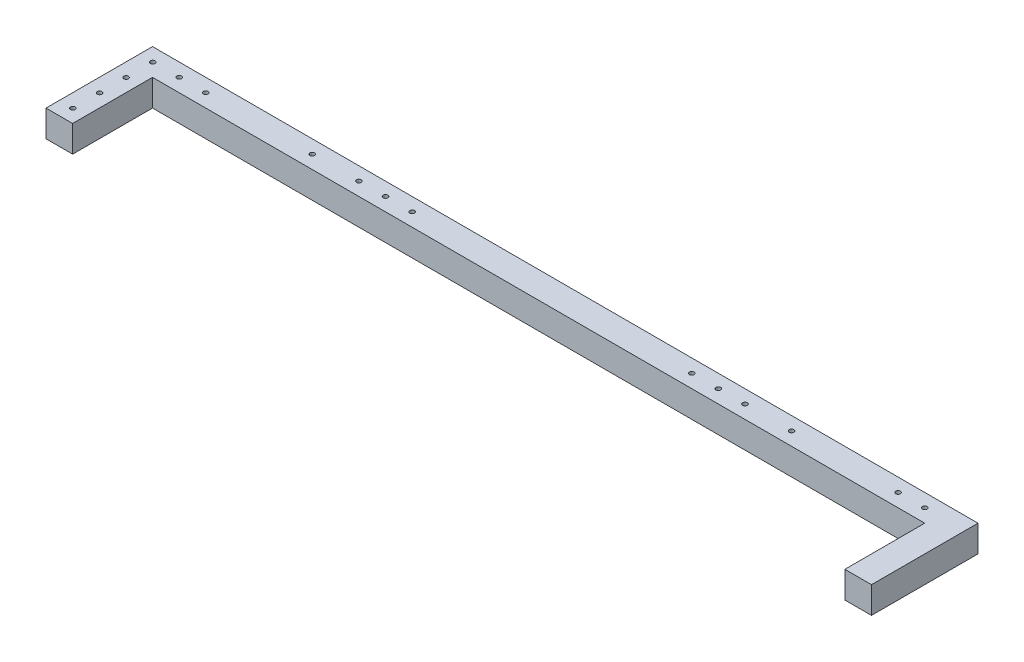
ISO-10303-21;
HEADER;
FILE_DESCRIPTION(('STEP AP214'),'2;1');
FILE_NAME('part.step','',(''),(''),'','','');
FILE_SCHEMA(('AUTOMOTIVE_DESIGN { 1 0 10303 214 1 1 1 1 }'));
ENDSEC;
DATA;
#1=APPLICATION_CONTEXT('core data for automotive mechanical design processes');
#2=APPLICATION_PROTOCOL_DEFINITION('international standard','automotive_design',2000,#1);
#3=PRODUCT_CONTEXT('',#1,'mechanical');
#4=PRODUCT('Part','Part','',(#3));
#5=PRODUCT_RELATED_PRODUCT_CATEGORY('part','',(#4));
#6=PRODUCT_DEFINITION_FORMATION('','',#4);
#7=PRODUCT_DEFINITION_CONTEXT('part definition',#1,'design');
#8=PRODUCT_DEFINITION('design','',#6,#7);
#9=PRODUCT_DEFINITION_SHAPE('','',#8);
#10=(LENGTH_UNIT() NAMED_UNIT(*) SI_UNIT(.MILLI.,.METRE.));
#11=(NAMED_UNIT(*) PLANE_ANGLE_UNIT() SI_UNIT($,.RADIAN.));
#12=(NAMED_UNIT(*) SI_UNIT($,.STERADIAN.) SOLID_ANGLE_UNIT());
#13=UNCERTAINTY_MEASURE_WITH_UNIT(LENGTH_MEASURE(1.E-05),#10,'distance_accuracy_value','');
#14=(GEOMETRIC_REPRESENTATION_CONTEXT(3) GLOBAL_UNCERTAINTY_ASSIGNED_CONTEXT((#13)) GLOBAL_UNIT_ASSIGNED_CONTEXT((#10,
#11,#12)) REPRESENTATION_CONTEXT('',''));
#15=CARTESIAN_POINT('',(0.,0.,0.));
#16=DIRECTION('',(0.,0.,1.));
#17=DIRECTION('',(1.,0.,0.));
#18=AXIS2_PLACEMENT_3D('',#15,#16,#17);
#19=CARTESIAN_POINT('',(0.,20.,0.));
#20=DIRECTION('',(0.,1.,0.));
#21=DIRECTION('',(0.,0.,1.));
#22=AXIS2_PLACEMENT_3D('',#19,#20,#21);
#23=PLANE('',#22);
#24=CARTESIAN_POINT('',(280.,20.,0.));
#25=DIRECTION('',(0.,1.,0.));
#26=DIRECTION('',(0.,0.,1.));
#27=AXIS2_PLACEMENT_3D('',#24,#25,#26);
#28=CIRCLE('',#27,1.74999999999998);
#29=CARTESIAN_POINT('',(280.,20.,1.74999999999999));
#30=VERTEX_POINT('',#29);
#31=EDGE_CURVE('E310',#30,#30,#28,.T.);
#32=ORIENTED_EDGE('',*,*,#31,.F.);
#33=EDGE_LOOP('',(#32));
#34=FACE_BOUND('',#33,.T.);
#35=CARTESIAN_POINT('',(260.,20.,0.));
#36=DIRECTION('',(0.,1.,0.));
#37=DIRECTION('',(0.,0.,1.));
#38=AXIS2_PLACEMENT_3D('',#35,#36,#37);
#39=CIRCLE('',#38,1.74999999999998);
#40=CARTESIAN_POINT('',(260.,20.,1.74999999999999));
#41=VERTEX_POINT('',#40);
#42=EDGE_CURVE('E309',#41,#41,#39,.T.);
#43=ORIENTED_EDGE('',*,*,#42,.F.);
#44=EDGE_LOOP('',(#43));
#45=FACE_BOUND('',#44,.T.);
#46=CARTESIAN_POINT('',(180.,20.,0.));
#47=DIRECTION('',(0.,1.,0.));
#48=DIRECTION('',(0.,0.,1.));
#49=AXIS2_PLACEMENT_3D('',#46,#47,#48);
#50=CIRCLE('',#49,1.75000000000001);
#51=CARTESIAN_POINT('',(180.,20.,1.75000000000002));
#52=VERTEX_POINT('',#51);
#53=EDGE_CURVE('E338',#52,#52,#50,.T.);
#54=ORIENTED_EDGE('',*,*,#53,.F.);
#55=EDGE_LOOP('',(#54));
#56=FACE_BOUND('',#55,.T.);
#57=CARTESIAN_POINT('',(145.,20.,0.));
#58=DIRECTION('',(0.,1.,0.));
#59=DIRECTION('',(0.,0.,1.));
#60=AXIS2_PLACEMENT_3D('',#57,#58,#59);
#61=CIRCLE('',#60,1.75000000000001);
#62=CARTESIAN_POINT('',(145.,20.,1.75000000000001));
#63=VERTEX_POINT('',#62);
#64=EDGE_CURVE('E371',#63,#63,#61,.T.);
#65=ORIENTED_EDGE('',*,*,#64,.F.);
#66=EDGE_LOOP('',(#65));
#67=FACE_BOUND('',#66,.T.);
#68=CARTESIAN_POINT('',(125.,20.,0.));
#69=DIRECTION('',(0.,1.,0.));
#70=DIRECTION('',(0.,0.,1.));
#71=AXIS2_PLACEMENT_3D('',#68,#69,#70);
#72=CIRCLE('',#71,1.75000000000001);
#73=CARTESIAN_POINT('',(125.,20.,1.75));
#74=VERTEX_POINT('',#73);
#75=EDGE_CURVE('E361',#74,#74,#72,.T.);
#76=ORIENTED_EDGE('',*,*,#75,.F.);
#77=EDGE_LOOP('',(#76));
#78=FACE_BOUND('',#77,.T.);
#79=CARTESIAN_POINT('',(105.,20.,0.));
#80=DIRECTION('',(0.,1.,0.));
#81=DIRECTION('',(0.,0.,1.));
#82=AXIS2_PLACEMENT_3D('',#79,#80,#81);
#83=CIRCLE('',#82,1.75);
#84=CARTESIAN_POINT('',(105.,20.,1.74999999999992));
#85=VERTEX_POINT('',#84);
#86=EDGE_CURVE('E354',#85,#85,#83,.T.);
#87=ORIENTED_EDGE('',*,*,#86,.F.);
#88=EDGE_LOOP('',(#87));
#89=FACE_BOUND('',#88,.T.);
#90=CARTESIAN_POINT('',(-145.,20.,0.));
#91=DIRECTION('',(0.,1.,0.));
#92=DIRECTION('',(0.,0.,1.));
#93=AXIS2_PLACEMENT_3D('',#90,#91,#92);
#94=CIRCLE('',#93,1.75000000000001);
#95=CARTESIAN_POINT('',(-145.,20.,1.74999999999995));
#96=VERTEX_POINT('',#95);
#97=EDGE_CURVE('E347',#96,#96,#94,.T.);
#98=ORIENTED_EDGE('',*,*,#97,.F.);
#99=EDGE_LOOP('',(#98));
#100=FACE_BOUND('',#99,.T.);
#101=CARTESIAN_POINT('',(-105.,20.,0.));
#102=DIRECTION('',(0.,1.,0.));
#103=DIRECTION('',(0.,0.,1.));
#104=AXIS2_PLACEMENT_3D('',#101,#102,#103);
#105=CIRCLE('',#104,1.75);
#106=CARTESIAN_POINT('',(-105.,20.,1.74999999999995));
#107=VERTEX_POINT('',#106);
#108=EDGE_CURVE('E343',#107,#107,#105,.T.);
#109=ORIENTED_EDGE('',*,*,#108,.F.);
#110=EDGE_LOOP('',(#109));
#111=FACE_BOUND('',#110,.T.);
#112=CARTESIAN_POINT('',(-125.,20.,0.));
#113=DIRECTION('',(0.,1.,0.));
#114=DIRECTION('',(0.,0.,1.));
#115=AXIS2_PLACEMENT_3D('',#112,#113,#114);
#116=CIRCLE('',#115,1.75000000000001);
#117=CARTESIAN_POINT('',(-125.,20.,1.74999999999996));
#118=VERTEX_POINT('',#117);
#119=EDGE_CURVE('E348',#118,#118,#116,.T.);
#120=ORIENTED_EDGE('',*,*,#119,.F.);
#121=EDGE_LOOP('',(#120));
#122=FACE_BOUND('',#121,.T.);
#123=CARTESIAN_POINT('',(-299.785666285405,20.,0.));
#124=DIRECTION('',(0.,1.,0.));
#125=DIRECTION('',(0.,0.,1.));
#126=AXIS2_PLACEMENT_3D('',#123,#124,#125);
#127=CIRCLE('',#126,1.74999999999998);
#128=CARTESIAN_POINT('',(-299.785666285405,20.,1.74999999999999));
#129=VERTEX_POINT('',#128);
#130=EDGE_CURVE('E389',#129,#129,#127,.T.);
#131=ORIENTED_EDGE('',*,*,#130,.F.);
#132=EDGE_LOOP('',(#131));
#133=FACE_BOUND('',#132,.T.);
#134=CARTESIAN_POINT('',(-299.785666285405,20.,20.));
#135=DIRECTION('',(0.,1.,0.));
#136=DIRECTION('',(0.,0.,1.));
#137=AXIS2_PLACEMENT_3D('',#134,#135,#136);
#138=CIRCLE('',#137,1.74999999999998);
#139=CARTESIAN_POINT('',(-299.785666285405,20.,21.75));
#140=VERTEX_POINT('',#139);
#141=EDGE_CURVE('E396',#140,#140,#138,.T.);
#142=ORIENTED_EDGE('',*,*,#141,.F.);
#143=EDGE_LOOP('',(#142));
#144=FACE_BOUND('',#143,.T.);
#145=CARTESIAN_POINT('',(-299.785666285405,20.,60.));
#146=DIRECTION('',(0.,1.,0.));
#147=DIRECTION('',(0.,0.,1.));
#148=AXIS2_PLACEMENT_3D('',#145,#146,#147);
#149=CIRCLE('',#148,1.74999999999998);
#150=CARTESIAN_POINT('',(-299.785666285405,20.,61.75));
#151=VERTEX_POINT('',#150);
#152=EDGE_CURVE('E386',#151,#151,#149,.T.);
#153=ORIENTED_EDGE('',*,*,#152,.F.);
#154=EDGE_LOOP('',(#153));
#155=FACE_BOUND('',#154,.T.);
#156=CARTESIAN_POINT('',(-299.785666285405,20.,40.));
#157=DIRECTION('',(0.,1.,0.));
#158=DIRECTION('',(0.,0.,1.));
#159=AXIS2_PLACEMENT_3D('',#156,#157,#158);
#160=CIRCLE('',#159,1.74999999999998);
#161=CARTESIAN_POINT('',(-299.785666285405,20.,41.75));
#162=VERTEX_POINT('',#161);
#163=EDGE_CURVE('E399',#162,#162,#160,.T.);
#164=ORIENTED_EDGE('',*,*,#163,.F.);
#165=EDGE_LOOP('',(#164));
#166=FACE_BOUND('',#165,.T.);
#167=DIRECTION('',(1.,0.,0.));
#168=VECTOR('',#167,1.);
#169=CARTESIAN_POINT('',(0.,20.,10.));
#170=LINE('',#169,#168);
#171=CARTESIAN_POINT('',(-290.,20.,10.));
#172=VERTEX_POINT('',#171);
#173=CARTESIAN_POINT('',(290.,20.,10.));
#174=VERTEX_POINT('',#173);
#175=EDGE_CURVE('E105',#172,#174,#170,.T.);
#176=ORIENTED_EDGE('',*,*,#175,.T.);
#177=DIRECTION('',(0.,0.,-1.));
#178=VECTOR('',#177,1.);
#179=CARTESIAN_POINT('',(290.,20.,0.));
#180=LINE('',#179,#178);
#181=CARTESIAN_POINT('',(290.,20.,70.));
#182=VERTEX_POINT('',#181);
#183=EDGE_CURVE('E201',#182,#174,#180,.T.);
#184=ORIENTED_EDGE('',*,*,#183,.F.);
#185=DIRECTION('',(1.,0.,0.));
#186=VECTOR('',#185,1.);
#187=CARTESIAN_POINT('',(0.,20.,70.));
#188=LINE('',#187,#186);
#189=CARTESIAN_POINT('',(310.,20.,70.));
#190=VERTEX_POINT('',#189);
#191=EDGE_CURVE('E191',#182,#190,#188,.T.);
#192=ORIENTED_EDGE('',*,*,#191,.T.);
#193=DIRECTION('',(0.,0.,1.));
#194=VECTOR('',#193,1.);
#195=CARTESIAN_POINT('',(310.,20.,0.));
#196=LINE('',#195,#194);
#197=CARTESIAN_POINT('',(310.,20.,-10.));
#198=VERTEX_POINT('',#197);
#199=EDGE_CURVE('E422',#198,#190,#196,.T.);
#200=ORIENTED_EDGE('',*,*,#199,.F.);
#201=DIRECTION('',(1.,0.,0.));
#202=VECTOR('',#201,1.);
#203=CARTESIAN_POINT('',(0.,20.,-10.));
#204=LINE('',#203,#202);
#205=CARTESIAN_POINT('',(-310.,20.,-9.99999999999999));
#206=VERTEX_POINT('',#205);
#207=EDGE_CURVE('E127',#206,#198,#204,.T.);
#208=ORIENTED_EDGE('',*,*,#207,.F.);
#209=DIRECTION('',(0.,0.,1.));
#210=VECTOR('',#209,1.);
#211=CARTESIAN_POINT('',(-310.,20.,0.));
#212=LINE('',#211,#210);
#213=CARTESIAN_POINT('',(-310.,20.,70.));
#214=VERTEX_POINT('',#213);
#215=EDGE_CURVE('E117',#206,#214,#212,.T.);
#216=ORIENTED_EDGE('',*,*,#215,.T.);
#217=DIRECTION('',(-1.,0.,0.));
#218=VECTOR('',#217,1.);
#219=CARTESIAN_POINT('',(0.,20.,70.));
#220=LINE('',#219,#218);
#221=CARTESIAN_POINT('',(-290.,20.,70.));
#222=VERTEX_POINT('',#221);
#223=EDGE_CURVE('E124',#222,#214,#220,.T.);
#224=ORIENTED_EDGE('',*,*,#223,.F.);
#225=DIRECTION('',(0.,0.,1.));
#226=VECTOR('',#225,1.);
#227=CARTESIAN_POINT('',(-290.,20.,0.));
#228=LINE('',#227,#226);
#229=EDGE_CURVE('E142',#172,#222,#228,.T.);
#230=ORIENTED_EDGE('',*,*,#229,.F.);
#231=EDGE_LOOP('',(#176,#184,#192,#200,#208,#216,#224,#230));
#232=FACE_BOUND('',#231,.T.);
#233=CARTESIAN_POINT('',(-180.,20.,0.));
#234=DIRECTION('',(0.,1.,0.));
#235=DIRECTION('',(0.,0.,1.));
#236=AXIS2_PLACEMENT_3D('',#233,#234,#235);
#237=CIRCLE('',#236,1.75000000000001);
#238=CARTESIAN_POINT('',(-180.,20.,1.75000000000002));
#239=VERTEX_POINT('',#238);
#240=EDGE_CURVE('E288',#239,#239,#237,.F.);
#241=ORIENTED_EDGE('',*,*,#240,.T.);
#242=EDGE_LOOP('',(#241));
#243=FACE_BOUND('',#242,.T.);
#244=CARTESIAN_POINT('',(-260.,20.,0.));
#245=DIRECTION('',(0.,1.,0.));
#246=DIRECTION('',(0.,0.,1.));
#247=AXIS2_PLACEMENT_3D('',#244,#245,#246);
#248=CIRCLE('',#247,1.74999999999998);
#249=CARTESIAN_POINT('',(-260.,20.,1.74999999999999));
#250=VERTEX_POINT('',#249);
#251=EDGE_CURVE('E298',#250,#250,#248,.F.);
#252=ORIENTED_EDGE('',*,*,#251,.T.);
#253=EDGE_LOOP('',(#252));
#254=FACE_BOUND('',#253,.T.);
#255=CARTESIAN_POINT('',(-280.,20.,0.));
#256=DIRECTION('',(0.,1.,0.));
#257=DIRECTION('',(0.,0.,1.));
#258=AXIS2_PLACEMENT_3D('',#255,#256,#257);
#259=CIRCLE('',#258,1.74999999999998);
#260=CARTESIAN_POINT('',(-280.,20.,1.74999999999999));
#261=VERTEX_POINT('',#260);
#262=EDGE_CURVE('E326',#261,#261,#259,.F.);
#263=ORIENTED_EDGE('',*,*,#262,.T.);
#264=EDGE_LOOP('',(#263));
#265=FACE_BOUND('',#264,.T.);
#266=ADVANCED_FACE('F50',(#34,#45,#56,#67,#78,#89,#100,#111,#122,#133,#144,#155,#166,#232,#243,
#254,#265),#23,.T.);
#267=CARTESIAN_POINT('',(0.,0.,0.));
#268=DIRECTION('',(0.,1.,0.));
#269=DIRECTION('',(0.,0.,1.));
#270=AXIS2_PLACEMENT_3D('',#267,#268,#269);
#271=PLANE('',#270);
#272=CARTESIAN_POINT('',(280.,0.,0.));
#273=DIRECTION('',(0.,-1.,0.));
#274=DIRECTION('',(0.,0.,-1.));
#275=AXIS2_PLACEMENT_3D('',#272,#273,#274);
#276=CIRCLE('',#275,1.74999999999998);
#277=CARTESIAN_POINT('',(280.,0.,-1.74999999999998));
#278=VERTEX_POINT('',#277);
#279=EDGE_CURVE('E303',#278,#278,#276,.F.);
#280=ORIENTED_EDGE('',*,*,#279,.T.);
#281=EDGE_LOOP('',(#280));
#282=FACE_BOUND('',#281,.T.);
#283=CARTESIAN_POINT('',(260.,0.,0.));
#284=DIRECTION('',(0.,-1.,0.));
#285=DIRECTION('',(0.,0.,-1.));
#286=AXIS2_PLACEMENT_3D('',#283,#284,#285);
#287=CIRCLE('',#286,1.74999999999998);
#288=CARTESIAN_POINT('',(260.,0.,-1.74999999999998));
#289=VERTEX_POINT('',#288);
#290=EDGE_CURVE('E312',#289,#289,#287,.F.);
#291=ORIENTED_EDGE('',*,*,#290,.T.);
#292=EDGE_LOOP('',(#291));
#293=FACE_BOUND('',#292,.T.);
#294=CARTESIAN_POINT('',(-260.,0.,0.));
#295=DIRECTION('',(0.,-1.,0.));
#296=DIRECTION('',(0.,0.,-1.));
#297=AXIS2_PLACEMENT_3D('',#294,#295,#296);
#298=CIRCLE('',#297,1.74999999999998);
#299=CARTESIAN_POINT('',(-260.,0.,-1.74999999999998));
#300=VERTEX_POINT('',#299);
#301=EDGE_CURVE('E302',#300,#300,#298,.T.);
#302=ORIENTED_EDGE('',*,*,#301,.F.);
#303=EDGE_LOOP('',(#302));
#304=FACE_BOUND('',#303,.T.);
#305=DIRECTION('',(1.,0.,0.));
#306=VECTOR('',#305,1.);
#307=CARTESIAN_POINT('',(0.,0.,10.));
#308=LINE('',#307,#306);
#309=CARTESIAN_POINT('',(-290.,0.,10.));
#310=VERTEX_POINT('',#309);
#311=CARTESIAN_POINT('',(290.,0.,10.));
#312=VERTEX_POINT('',#311);
#313=EDGE_CURVE('E146',#310,#312,#308,.T.);
#314=ORIENTED_EDGE('',*,*,#313,.F.);
#315=DIRECTION('',(0.,0.,1.));
#316=VECTOR('',#315,1.);
#317=CARTESIAN_POINT('',(-290.,0.,0.));
#318=LINE('',#317,#316);
#319=CARTESIAN_POINT('',(-290.,0.,70.));
#320=VERTEX_POINT('',#319);
#321=EDGE_CURVE('E171',#310,#320,#318,.T.);
#322=ORIENTED_EDGE('',*,*,#321,.T.);
#323=DIRECTION('',(-1.,0.,0.));
#324=VECTOR('',#323,1.);
#325=CARTESIAN_POINT('',(0.,0.,70.));
#326=LINE('',#325,#324);
#327=CARTESIAN_POINT('',(-310.,0.,70.));
#328=VERTEX_POINT('',#327);
#329=EDGE_CURVE('E168',#320,#328,#326,.T.);
#330=ORIENTED_EDGE('',*,*,#329,.T.);
#331=DIRECTION('',(0.,0.,1.));
#332=VECTOR('',#331,1.);
#333=CARTESIAN_POINT('',(-310.,0.,0.));
#334=LINE('',#333,#332);
#335=CARTESIAN_POINT('',(-310.,0.,-9.99999999999999));
#336=VERTEX_POINT('',#335);
#337=EDGE_CURVE('E132',#336,#328,#334,.T.);
#338=ORIENTED_EDGE('',*,*,#337,.F.);
#339=DIRECTION('',(1.,0.,0.));
#340=VECTOR('',#339,1.);
#341=CARTESIAN_POINT('',(0.,0.,-10.));
#342=LINE('',#341,#340);
#343=CARTESIAN_POINT('',(310.,0.,-10.));
#344=VERTEX_POINT('',#343);
#345=EDGE_CURVE('E163',#336,#344,#342,.T.);
#346=ORIENTED_EDGE('',*,*,#345,.T.);
#347=DIRECTION('',(0.,0.,1.));
#348=VECTOR('',#347,1.);
#349=CARTESIAN_POINT('',(310.,0.,0.));
#350=LINE('',#349,#348);
#351=CARTESIAN_POINT('',(310.,0.,70.));
#352=VERTEX_POINT('',#351);
#353=EDGE_CURVE('E159',#344,#352,#350,.T.);
#354=ORIENTED_EDGE('',*,*,#353,.T.);
#355=DIRECTION('',(1.,0.,0.));
#356=VECTOR('',#355,1.);
#357=CARTESIAN_POINT('',(0.,0.,70.));
#358=LINE('',#357,#356);
#359=CARTESIAN_POINT('',(290.,0.,70.));
#360=VERTEX_POINT('',#359);
#361=EDGE_CURVE('E156',#360,#352,#358,.T.);
#362=ORIENTED_EDGE('',*,*,#361,.F.);
#363=DIRECTION('',(0.,0.,-1.));
#364=VECTOR('',#363,1.);
#365=CARTESIAN_POINT('',(290.,0.,0.));
#366=LINE('',#365,#364);
#367=EDGE_CURVE('E151',#360,#312,#366,.T.);
#368=ORIENTED_EDGE('',*,*,#367,.T.);
#369=EDGE_LOOP('',(#314,#322,#330,#338,#346,#354,#362,#368));
#370=FACE_BOUND('',#369,.T.);
#371=CARTESIAN_POINT('',(-299.785666285405,0.,40.));
#372=DIRECTION('',(0.,1.,0.));
#373=DIRECTION('',(0.,0.,1.));
#374=AXIS2_PLACEMENT_3D('',#371,#372,#373);
#375=CIRCLE('',#374,1.74999999999998);
#376=CARTESIAN_POINT('',(-299.785666285405,0.,41.75));
#377=VERTEX_POINT('',#376);
#378=EDGE_CURVE('E155',#377,#377,#375,.F.);
#379=ORIENTED_EDGE('',*,*,#378,.F.);
#380=EDGE_LOOP('',(#379));
#381=FACE_BOUND('',#380,.T.);
#382=CARTESIAN_POINT('',(-299.785666285405,0.,60.));
#383=DIRECTION('',(0.,1.,0.));
#384=DIRECTION('',(0.,0.,1.));
#385=AXIS2_PLACEMENT_3D('',#382,#383,#384);
#386=CIRCLE('',#385,1.74999999999998);
#387=CARTESIAN_POINT('',(-299.785666285405,0.,61.75));
#388=VERTEX_POINT('',#387);
#389=EDGE_CURVE('E391',#388,#388,#386,.F.);
#390=ORIENTED_EDGE('',*,*,#389,.F.);
#391=EDGE_LOOP('',(#390));
#392=FACE_BOUND('',#391,.T.);
#393=CARTESIAN_POINT('',(-299.785666285405,0.,20.));
#394=DIRECTION('',(0.,1.,0.));
#395=DIRECTION('',(0.,0.,1.));
#396=AXIS2_PLACEMENT_3D('',#393,#394,#395);
#397=CIRCLE('',#396,1.74999999999998);
#398=CARTESIAN_POINT('',(-299.785666285405,0.,21.75));
#399=VERTEX_POINT('',#398);
#400=EDGE_CURVE('E392',#399,#399,#397,.F.);
#401=ORIENTED_EDGE('',*,*,#400,.F.);
#402=EDGE_LOOP('',(#401));
#403=FACE_BOUND('',#402,.T.);
#404=CARTESIAN_POINT('',(-299.785666285405,0.,0.));
#405=DIRECTION('',(0.,1.,0.));
#406=DIRECTION('',(0.,0.,1.));
#407=AXIS2_PLACEMENT_3D('',#404,#405,#406);
#408=CIRCLE('',#407,1.74999999999998);
#409=CARTESIAN_POINT('',(-299.785666285405,0.,1.74999999999999));
#410=VERTEX_POINT('',#409);
#411=EDGE_CURVE('E401',#410,#410,#408,.F.);
#412=ORIENTED_EDGE('',*,*,#411,.F.);
#413=EDGE_LOOP('',(#412));
#414=FACE_BOUND('',#413,.T.);
#415=CARTESIAN_POINT('',(-125.,0.,0.));
#416=DIRECTION('',(0.,1.,0.));
#417=DIRECTION('',(0.,0.,1.));
#418=AXIS2_PLACEMENT_3D('',#415,#416,#417);
#419=CIRCLE('',#418,1.75000000000001);
#420=CARTESIAN_POINT('',(-125.,0.,1.74999999999996));
#421=VERTEX_POINT('',#420);
#422=EDGE_CURVE('E383',#421,#421,#419,.F.);
#423=ORIENTED_EDGE('',*,*,#422,.F.);
#424=EDGE_LOOP('',(#423));
#425=FACE_BOUND('',#424,.T.);
#426=CARTESIAN_POINT('',(-105.,0.,0.));
#427=DIRECTION('',(0.,1.,0.));
#428=DIRECTION('',(0.,0.,1.));
#429=AXIS2_PLACEMENT_3D('',#426,#427,#428);
#430=CIRCLE('',#429,1.75);
#431=CARTESIAN_POINT('',(-105.,0.,1.74999999999995));
#432=VERTEX_POINT('',#431);
#433=EDGE_CURVE('E342',#432,#432,#430,.F.);
#434=ORIENTED_EDGE('',*,*,#433,.F.);
#435=EDGE_LOOP('',(#434));
#436=FACE_BOUND('',#435,.T.);
#437=CARTESIAN_POINT('',(-145.,0.,0.));
#438=DIRECTION('',(0.,1.,0.));
#439=DIRECTION('',(0.,0.,1.));
#440=AXIS2_PLACEMENT_3D('',#437,#438,#439);
#441=CIRCLE('',#440,1.75000000000001);
#442=CARTESIAN_POINT('',(-145.,0.,1.74999999999995));
#443=VERTEX_POINT('',#442);
#444=EDGE_CURVE('E353',#443,#443,#441,.F.);
#445=ORIENTED_EDGE('',*,*,#444,.F.);
#446=EDGE_LOOP('',(#445));
#447=FACE_BOUND('',#446,.T.);
#448=CARTESIAN_POINT('',(105.,0.,0.));
#449=DIRECTION('',(0.,1.,0.));
#450=DIRECTION('',(0.,0.,1.));
#451=AXIS2_PLACEMENT_3D('',#448,#449,#450);
#452=CIRCLE('',#451,1.75);
#453=CARTESIAN_POINT('',(105.,0.,1.74999999999992));
#454=VERTEX_POINT('',#453);
#455=EDGE_CURVE('E356',#454,#454,#452,.F.);
#456=ORIENTED_EDGE('',*,*,#455,.F.);
#457=EDGE_LOOP('',(#456));
#458=FACE_BOUND('',#457,.T.);
#459=CARTESIAN_POINT('',(125.,0.,0.));
#460=DIRECTION('',(0.,1.,0.));
#461=DIRECTION('',(0.,0.,1.));
#462=AXIS2_PLACEMENT_3D('',#459,#460,#461);
#463=CIRCLE('',#462,1.75000000000001);
#464=CARTESIAN_POINT('',(125.,0.,1.75));
#465=VERTEX_POINT('',#464);
#466=EDGE_CURVE('E370',#465,#465,#463,.F.);
#467=ORIENTED_EDGE('',*,*,#466,.F.);
#468=EDGE_LOOP('',(#467));
#469=FACE_BOUND('',#468,.T.);
#470=CARTESIAN_POINT('',(145.,0.,0.));
#471=DIRECTION('',(0.,1.,0.));
#472=DIRECTION('',(0.,0.,1.));
#473=AXIS2_PLACEMENT_3D('',#470,#471,#472);
#474=CIRCLE('',#473,1.75000000000001);
#475=CARTESIAN_POINT('',(145.,0.,1.75000000000001));
#476=VERTEX_POINT('',#475);
#477=EDGE_CURVE('E339',#476,#476,#474,.F.);
#478=ORIENTED_EDGE('',*,*,#477,.F.);
#479=EDGE_LOOP('',(#478));
#480=FACE_BOUND('',#479,.T.);
#481=CARTESIAN_POINT('',(180.,0.,0.));
#482=DIRECTION('',(0.,-1.,0.));
#483=DIRECTION('',(0.,0.,-1.));
#484=AXIS2_PLACEMENT_3D('',#481,#482,#483);
#485=CIRCLE('',#484,1.75000000000001);
#486=CARTESIAN_POINT('',(180.,0.,-1.75));
#487=VERTEX_POINT('',#486);
#488=EDGE_CURVE('E314',#487,#487,#485,.F.);
#489=ORIENTED_EDGE('',*,*,#488,.T.);
#490=EDGE_LOOP('',(#489));
#491=FACE_BOUND('',#490,.T.);
#492=CARTESIAN_POINT('',(-180.,0.,0.));
#493=DIRECTION('',(0.,-1.,0.));
#494=DIRECTION('',(0.,0.,-1.));
#495=AXIS2_PLACEMENT_3D('',#492,#493,#494);
#496=CIRCLE('',#495,1.75000000000001);
#497=CARTESIAN_POINT('',(-180.,0.,-1.75));
#498=VERTEX_POINT('',#497);
#499=EDGE_CURVE('E291',#498,#498,#496,.T.);
#500=ORIENTED_EDGE('',*,*,#499,.F.);
#501=EDGE_LOOP('',(#500));
#502=FACE_BOUND('',#501,.T.);
#503=CARTESIAN_POINT('',(-280.,0.,0.));
#504=DIRECTION('',(0.,-1.,0.));
#505=DIRECTION('',(0.,0.,-1.));
#506=AXIS2_PLACEMENT_3D('',#503,#504,#505);
#507=CIRCLE('',#506,1.74999999999998);
#508=CARTESIAN_POINT('',(-280.,0.,-1.74999999999998));
#509=VERTEX_POINT('',#508);
#510=EDGE_CURVE('E317',#509,#509,#507,.T.);
#511=ORIENTED_EDGE('',*,*,#510,.F.);
#512=EDGE_LOOP('',(#511));
#513=FACE_BOUND('',#512,.T.);
#514=ADVANCED_FACE('F200',(#282,#293,#304,#370,#381,#392,#403,#414,#425,#436,#447,#458,#469,
#480,#491,#502,#513),#271,.F.);
#515=CARTESIAN_POINT('',(0.,20.,10.));
#516=DIRECTION('',(0.,0.,-1.));
#517=DIRECTION('',(-1.,0.,0.));
#518=AXIS2_PLACEMENT_3D('',#515,#516,#517);
#519=PLANE('',#518);
#520=ORIENTED_EDGE('',*,*,#313,.T.);
#521=DIRECTION('',(0.,-1.,0.));
#522=VECTOR('',#521,1.);
#523=CARTESIAN_POINT('',(290.,20.,10.));
#524=LINE('',#523,#522);
#525=EDGE_CURVE('E11',#174,#312,#524,.T.);
#526=ORIENTED_EDGE('',*,*,#525,.F.);
#527=ORIENTED_EDGE('',*,*,#175,.F.);
#528=DIRECTION('',(0.,-1.,0.));
#529=VECTOR('',#528,1.);
#530=CARTESIAN_POINT('',(-290.,20.,10.));
#531=LINE('',#530,#529);
#532=EDGE_CURVE('E64',#172,#310,#531,.T.);
#533=ORIENTED_EDGE('',*,*,#532,.T.);
#534=EDGE_LOOP('',(#520,#526,#527,#533));
#535=FACE_BOUND('',#534,.T.);
#536=ADVANCED_FACE('F47',(#535),#519,.F.);
#537=CARTESIAN_POINT('',(290.,20.,0.));
#538=DIRECTION('',(-1.,0.,0.));
#539=DIRECTION('',(0.,0.,1.));
#540=AXIS2_PLACEMENT_3D('',#537,#538,#539);
#541=PLANE('',#540);
#542=ORIENTED_EDGE('',*,*,#367,.F.);
#543=DIRECTION('',(0.,-1.,0.));
#544=VECTOR('',#543,1.);
#545=CARTESIAN_POINT('',(290.,20.,70.));
#546=LINE('',#545,#544);
#547=EDGE_CURVE('E60',#182,#360,#546,.T.);
#548=ORIENTED_EDGE('',*,*,#547,.F.);
#549=ORIENTED_EDGE('',*,*,#183,.T.);
#550=ORIENTED_EDGE('',*,*,#525,.T.);
#551=EDGE_LOOP('',(#542,#548,#549,#550));
#552=FACE_BOUND('',#551,.T.);
#553=ADVANCED_FACE('F205',(#552),#541,.T.);
#554=CARTESIAN_POINT('',(0.,20.,70.));
#555=DIRECTION('',(0.,0.,-1.));
#556=DIRECTION('',(-1.,0.,0.));
#557=AXIS2_PLACEMENT_3D('',#554,#555,#556);
#558=PLANE('',#557);
#559=ORIENTED_EDGE('',*,*,#361,.T.);
#560=DIRECTION('',(0.,-1.,0.));
#561=VECTOR('',#560,1.);
#562=CARTESIAN_POINT('',(310.,20.,70.));
#563=LINE('',#562,#561);
#564=EDGE_CURVE('E188',#190,#352,#563,.T.);
#565=ORIENTED_EDGE('',*,*,#564,.F.);
#566=ORIENTED_EDGE('',*,*,#191,.F.);
#567=ORIENTED_EDGE('',*,*,#547,.T.);
#568=EDGE_LOOP('',(#559,#565,#566,#567));
#569=FACE_BOUND('',#568,.T.);
#570=ADVANCED_FACE('F195',(#569),#558,.F.);
#571=CARTESIAN_POINT('',(310.,20.,0.));
#572=DIRECTION('',(1.,0.,0.));
#573=DIRECTION('',(0.,0.,-1.));
#574=AXIS2_PLACEMENT_3D('',#571,#572,#573);
#575=PLANE('',#574);
#576=ORIENTED_EDGE('',*,*,#353,.F.);
#577=DIRECTION('',(0.,-1.,0.));
#578=VECTOR('',#577,1.);
#579=CARTESIAN_POINT('',(310.,20.,-10.));
#580=LINE('',#579,#578);
#581=EDGE_CURVE('E181',#198,#344,#580,.T.);
#582=ORIENTED_EDGE('',*,*,#581,.F.);
#583=ORIENTED_EDGE('',*,*,#199,.T.);
#584=ORIENTED_EDGE('',*,*,#564,.T.);
#585=EDGE_LOOP('',(#576,#582,#583,#584));
#586=FACE_BOUND('',#585,.T.);
#587=ADVANCED_FACE('F433',(#586),#575,.T.);
#588=CARTESIAN_POINT('',(0.,20.,-10.));
#589=DIRECTION('',(0.,0.,-1.));
#590=DIRECTION('',(-1.,0.,0.));
#591=AXIS2_PLACEMENT_3D('',#588,#589,#590);
#592=PLANE('',#591);
#593=ORIENTED_EDGE('',*,*,#345,.F.);
#594=DIRECTION('',(0.,-1.,0.));
#595=VECTOR('',#594,1.);
#596=CARTESIAN_POINT('',(-310.,20.,-9.99999999999999));
#597=LINE('',#596,#595);
#598=EDGE_CURVE('E139',#206,#336,#597,.T.);
#599=ORIENTED_EDGE('',*,*,#598,.F.);
#600=ORIENTED_EDGE('',*,*,#207,.T.);
#601=ORIENTED_EDGE('',*,*,#581,.T.);
#602=EDGE_LOOP('',(#593,#599,#600,#601));
#603=FACE_BOUND('',#602,.T.);
#604=ADVANCED_FACE('F431',(#603),#592,.T.);
#605=CARTESIAN_POINT('',(-310.,20.,0.));
#606=DIRECTION('',(1.,0.,0.));
#607=DIRECTION('',(0.,0.,-1.));
#608=AXIS2_PLACEMENT_3D('',#605,#606,#607);
#609=PLANE('',#608);
#610=ORIENTED_EDGE('',*,*,#337,.T.);
#611=DIRECTION('',(0.,-1.,0.));
#612=VECTOR('',#611,1.);
#613=CARTESIAN_POINT('',(-310.,20.,70.));
#614=LINE('',#613,#612);
#615=EDGE_CURVE('E133',#214,#328,#614,.T.);
#616=ORIENTED_EDGE('',*,*,#615,.F.);
#617=ORIENTED_EDGE('',*,*,#215,.F.);
#618=ORIENTED_EDGE('',*,*,#598,.T.);
#619=EDGE_LOOP('',(#610,#616,#617,#618));
#620=FACE_BOUND('',#619,.T.);
#621=ADVANCED_FACE('F135',(#620),#609,.F.);
#622=CARTESIAN_POINT('',(0.,20.,70.));
#623=DIRECTION('',(0.,0.,1.));
#624=DIRECTION('',(1.,0.,0.));
#625=AXIS2_PLACEMENT_3D('',#622,#623,#624);
#626=PLANE('',#625);
#627=ORIENTED_EDGE('',*,*,#329,.F.);
#628=DIRECTION('',(0.,-1.,0.));
#629=VECTOR('',#628,1.);
#630=CARTESIAN_POINT('',(-290.,20.,70.));
#631=LINE('',#630,#629);
#632=EDGE_CURVE('E89',#222,#320,#631,.T.);
#633=ORIENTED_EDGE('',*,*,#632,.F.);
#634=ORIENTED_EDGE('',*,*,#223,.T.);
#635=ORIENTED_EDGE('',*,*,#615,.T.);
#636=EDGE_LOOP('',(#627,#633,#634,#635));
#637=FACE_BOUND('',#636,.T.);
#638=ADVANCED_FACE('F138',(#637),#626,.T.);
#639=CARTESIAN_POINT('',(-290.,20.,0.));
#640=DIRECTION('',(1.,0.,0.));
#641=DIRECTION('',(0.,0.,-1.));
#642=AXIS2_PLACEMENT_3D('',#639,#640,#641);
#643=PLANE('',#642);
#644=ORIENTED_EDGE('',*,*,#321,.F.);
#645=ORIENTED_EDGE('',*,*,#532,.F.);
#646=ORIENTED_EDGE('',*,*,#229,.T.);
#647=ORIENTED_EDGE('',*,*,#632,.T.);
#648=EDGE_LOOP('',(#644,#645,#646,#647));
#649=FACE_BOUND('',#648,.T.);
#650=ADVANCED_FACE('F204',(#649),#643,.T.);
#651=CARTESIAN_POINT('',(-299.785666285405,-0.001000000000001,40.));
#652=DIRECTION('',(0.,1.,0.));
#653=DIRECTION('',(0.,0.,1.));
#654=AXIS2_PLACEMENT_3D('',#651,#652,#653);
#655=CYLINDRICAL_SURFACE('',#654,1.74999999999998);
#656=ORIENTED_EDGE('',*,*,#163,.T.);
#657=EDGE_LOOP('',(#656));
#658=FACE_BOUND('',#657,.T.);
#659=ORIENTED_EDGE('',*,*,#378,.T.);
#660=EDGE_LOOP('',(#659));
#661=FACE_BOUND('',#660,.T.);
#662=ADVANCED_FACE('F206',(#658,#661),#655,.F.);
#663=CARTESIAN_POINT('',(-299.785666285405,-0.001000000000001,60.));
#664=DIRECTION('',(0.,1.,0.));
#665=DIRECTION('',(0.,0.,1.));
#666=AXIS2_PLACEMENT_3D('',#663,#664,#665);
#667=CYLINDRICAL_SURFACE('',#666,1.74999999999998);
#668=ORIENTED_EDGE('',*,*,#152,.T.);
#669=EDGE_LOOP('',(#668));
#670=FACE_BOUND('',#669,.T.);
#671=ORIENTED_EDGE('',*,*,#389,.T.);
#672=EDGE_LOOP('',(#671));
#673=FACE_BOUND('',#672,.T.);
#674=ADVANCED_FACE('F215',(#670,#673),#667,.F.);
#675=CARTESIAN_POINT('',(-299.785666285405,-0.001000000000001,20.));
#676=DIRECTION('',(0.,1.,0.));
#677=DIRECTION('',(0.,0.,1.));
#678=AXIS2_PLACEMENT_3D('',#675,#676,#677);
#679=CYLINDRICAL_SURFACE('',#678,1.74999999999998);
#680=ORIENTED_EDGE('',*,*,#141,.T.);
#681=EDGE_LOOP('',(#680));
#682=FACE_BOUND('',#681,.T.);
#683=ORIENTED_EDGE('',*,*,#400,.T.);
#684=EDGE_LOOP('',(#683));
#685=FACE_BOUND('',#684,.T.);
#686=ADVANCED_FACE('F235',(#682,#685),#679,.F.);
#687=CARTESIAN_POINT('',(-299.785666285405,-0.001000000000001,0.));
#688=DIRECTION('',(0.,1.,0.));
#689=DIRECTION('',(0.,0.,1.));
#690=AXIS2_PLACEMENT_3D('',#687,#688,#689);
#691=CYLINDRICAL_SURFACE('',#690,1.74999999999998);
#692=ORIENTED_EDGE('',*,*,#130,.T.);
#693=EDGE_LOOP('',(#692));
#694=FACE_BOUND('',#693,.T.);
#695=ORIENTED_EDGE('',*,*,#411,.T.);
#696=EDGE_LOOP('',(#695));
#697=FACE_BOUND('',#696,.T.);
#698=ADVANCED_FACE('F226',(#694,#697),#691,.F.);
#699=CARTESIAN_POINT('',(-125.,-0.001000000000001,0.));
#700=DIRECTION('',(0.,1.,0.));
#701=DIRECTION('',(0.,0.,1.));
#702=AXIS2_PLACEMENT_3D('',#699,#700,#701);
#703=CYLINDRICAL_SURFACE('',#702,1.75000000000001);
#704=ORIENTED_EDGE('',*,*,#119,.T.);
#705=EDGE_LOOP('',(#704));
#706=FACE_BOUND('',#705,.T.);
#707=ORIENTED_EDGE('',*,*,#422,.T.);
#708=EDGE_LOOP('',(#707));
#709=FACE_BOUND('',#708,.T.);
#710=ADVANCED_FACE('F232',(#706,#709),#703,.F.);
#711=CARTESIAN_POINT('',(-105.,-0.001000000000001,0.));
#712=DIRECTION('',(0.,1.,0.));
#713=DIRECTION('',(0.,0.,1.));
#714=AXIS2_PLACEMENT_3D('',#711,#712,#713);
#715=CYLINDRICAL_SURFACE('',#714,1.75);
#716=ORIENTED_EDGE('',*,*,#108,.T.);
#717=EDGE_LOOP('',(#716));
#718=FACE_BOUND('',#717,.T.);
#719=ORIENTED_EDGE('',*,*,#433,.T.);
#720=EDGE_LOOP('',(#719));
#721=FACE_BOUND('',#720,.T.);
#722=ADVANCED_FACE('F245',(#718,#721),#715,.F.);
#723=CARTESIAN_POINT('',(-145.,-0.001000000000001,0.));
#724=DIRECTION('',(0.,1.,0.));
#725=DIRECTION('',(0.,0.,1.));
#726=AXIS2_PLACEMENT_3D('',#723,#724,#725);
#727=CYLINDRICAL_SURFACE('',#726,1.75000000000001);
#728=ORIENTED_EDGE('',*,*,#97,.T.);
#729=EDGE_LOOP('',(#728));
#730=FACE_BOUND('',#729,.T.);
#731=ORIENTED_EDGE('',*,*,#444,.T.);
#732=EDGE_LOOP('',(#731));
#733=FACE_BOUND('',#732,.T.);
#734=ADVANCED_FACE('F254',(#730,#733),#727,.F.);
#735=CARTESIAN_POINT('',(105.,-0.001000000000001,0.));
#736=DIRECTION('',(0.,1.,0.));
#737=DIRECTION('',(0.,0.,1.));
#738=AXIS2_PLACEMENT_3D('',#735,#736,#737);
#739=CYLINDRICAL_SURFACE('',#738,1.75);
#740=ORIENTED_EDGE('',*,*,#86,.T.);
#741=EDGE_LOOP('',(#740));
#742=FACE_BOUND('',#741,.T.);
#743=ORIENTED_EDGE('',*,*,#455,.T.);
#744=EDGE_LOOP('',(#743));
#745=FACE_BOUND('',#744,.T.);
#746=ADVANCED_FACE('F253',(#742,#745),#739,.F.);
#747=CARTESIAN_POINT('',(125.,-0.001000000000001,0.));
#748=DIRECTION('',(0.,1.,0.));
#749=DIRECTION('',(0.,0.,1.));
#750=AXIS2_PLACEMENT_3D('',#747,#748,#749);
#751=CYLINDRICAL_SURFACE('',#750,1.75000000000001);
#752=ORIENTED_EDGE('',*,*,#75,.T.);
#753=EDGE_LOOP('',(#752));
#754=FACE_BOUND('',#753,.T.);
#755=ORIENTED_EDGE('',*,*,#466,.T.);
#756=EDGE_LOOP('',(#755));
#757=FACE_BOUND('',#756,.T.);
#758=ADVANCED_FACE('F250',(#754,#757),#751,.F.);
#759=CARTESIAN_POINT('',(145.,-0.001000000000001,0.));
#760=DIRECTION('',(0.,1.,0.));
#761=DIRECTION('',(0.,0.,1.));
#762=AXIS2_PLACEMENT_3D('',#759,#760,#761);
#763=CYLINDRICAL_SURFACE('',#762,1.75000000000001);
#764=ORIENTED_EDGE('',*,*,#64,.T.);
#765=EDGE_LOOP('',(#764));
#766=FACE_BOUND('',#765,.T.);
#767=ORIENTED_EDGE('',*,*,#477,.T.);
#768=EDGE_LOOP('',(#767));
#769=FACE_BOUND('',#768,.T.);
#770=ADVANCED_FACE('F242',(#766,#769),#763,.F.);
#771=CARTESIAN_POINT('',(180.,20.001,0.));
#772=DIRECTION('',(0.,-1.,0.));
#773=DIRECTION('',(0.,0.,-1.));
#774=AXIS2_PLACEMENT_3D('',#771,#772,#773);
#775=CYLINDRICAL_SURFACE('',#774,1.75000000000001);
#776=ORIENTED_EDGE('',*,*,#53,.T.);
#777=EDGE_LOOP('',(#776));
#778=FACE_BOUND('',#777,.T.);
#779=ORIENTED_EDGE('',*,*,#488,.F.);
#780=EDGE_LOOP('',(#779));
#781=FACE_BOUND('',#780,.T.);
#782=ADVANCED_FACE('F247',(#778,#781),#775,.F.);
#783=CARTESIAN_POINT('',(-180.,20.001,0.));
#784=DIRECTION('',(0.,-1.,0.));
#785=DIRECTION('',(0.,0.,-1.));
#786=AXIS2_PLACEMENT_3D('',#783,#784,#785);
#787=CYLINDRICAL_SURFACE('',#786,1.75000000000001);
#788=ORIENTED_EDGE('',*,*,#240,.F.);
#789=EDGE_LOOP('',(#788));
#790=FACE_BOUND('',#789,.T.);
#791=ORIENTED_EDGE('',*,*,#499,.T.);
#792=EDGE_LOOP('',(#791));
#793=FACE_BOUND('',#792,.T.);
#794=ADVANCED_FACE('F264',(#790,#793),#787,.F.);
#795=CARTESIAN_POINT('',(-260.,20.001,0.));
#796=DIRECTION('',(0.,-1.,0.));
#797=DIRECTION('',(0.,0.,-1.));
#798=AXIS2_PLACEMENT_3D('',#795,#796,#797);
#799=CYLINDRICAL_SURFACE('',#798,1.74999999999998);
#800=ORIENTED_EDGE('',*,*,#251,.F.);
#801=EDGE_LOOP('',(#800));
#802=FACE_BOUND('',#801,.T.);
#803=ORIENTED_EDGE('',*,*,#301,.T.);
#804=EDGE_LOOP('',(#803));
#805=FACE_BOUND('',#804,.T.);
#806=ADVANCED_FACE('F270',(#802,#805),#799,.F.);
#807=CARTESIAN_POINT('',(-280.,20.001,0.));
#808=DIRECTION('',(0.,-1.,0.));
#809=DIRECTION('',(0.,0.,-1.));
#810=AXIS2_PLACEMENT_3D('',#807,#808,#809);
#811=CYLINDRICAL_SURFACE('',#810,1.74999999999998);
#812=ORIENTED_EDGE('',*,*,#262,.F.);
#813=EDGE_LOOP('',(#812));
#814=FACE_BOUND('',#813,.T.);
#815=ORIENTED_EDGE('',*,*,#510,.T.);
#816=EDGE_LOOP('',(#815));
#817=FACE_BOUND('',#816,.T.);
#818=ADVANCED_FACE('F269',(#814,#817),#811,.F.);
#819=CARTESIAN_POINT('',(260.,20.001,0.));
#820=DIRECTION('',(0.,-1.,0.));
#821=DIRECTION('',(0.,0.,-1.));
#822=AXIS2_PLACEMENT_3D('',#819,#820,#821);
#823=CYLINDRICAL_SURFACE('',#822,1.74999999999998);
#824=ORIENTED_EDGE('',*,*,#42,.T.);
#825=EDGE_LOOP('',(#824));
#826=FACE_BOUND('',#825,.T.);
#827=ORIENTED_EDGE('',*,*,#290,.F.);
#828=EDGE_LOOP('',(#827));
#829=FACE_BOUND('',#828,.T.);
#830=ADVANCED_FACE('F273',(#826,#829),#823,.F.);
#831=CARTESIAN_POINT('',(280.,20.001,0.));
#832=DIRECTION('',(0.,-1.,0.));
#833=DIRECTION('',(0.,0.,-1.));
#834=AXIS2_PLACEMENT_3D('',#831,#832,#833);
#835=CYLINDRICAL_SURFACE('',#834,1.74999999999998);
#836=ORIENTED_EDGE('',*,*,#31,.T.);
#837=EDGE_LOOP('',(#836));
#838=FACE_BOUND('',#837,.T.);
#839=ORIENTED_EDGE('',*,*,#279,.F.);
#840=EDGE_LOOP('',(#839));
#841=FACE_BOUND('',#840,.T.);
#842=ADVANCED_FACE('F279',(#838,#841),#835,.F.);
#843=CLOSED_SHELL('',(#266,#514,#536,#553,#570,#587,#604,#621,#638,#650,#662,#674,#686,#698,
#710,#722,#734,#746,#758,#770,#782,#794,#806,#818,#830,#842));
#844=MANIFOLD_SOLID_BREP('B2',#843);
#845=ADVANCED_BREP_SHAPE_REPRESENTATION('',(#18,#844),#14);
#846=SHAPE_DEFINITION_REPRESENTATION(#9,#845);
ENDSEC;
END-ISO-10303-21;
